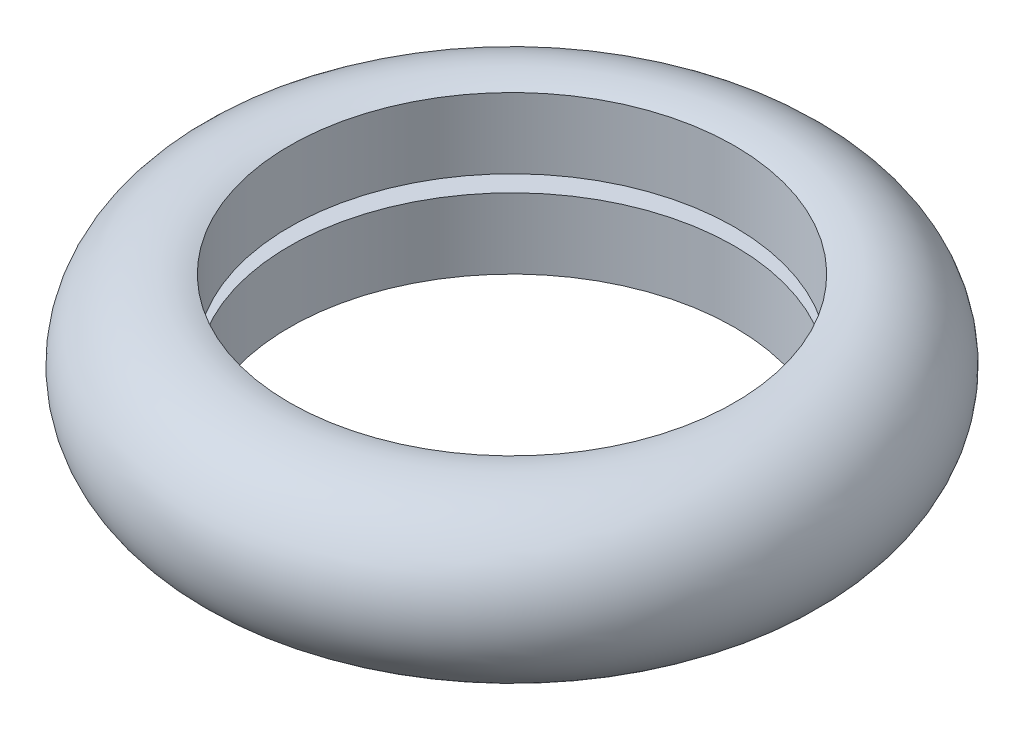
ISO-10303-21;
HEADER;
FILE_DESCRIPTION(('STEP AP214'),'2;1');
FILE_NAME('part.step','',(''),(''),'','','');
FILE_SCHEMA(('AUTOMOTIVE_DESIGN { 1 0 10303 214 1 1 1 1 }'));
ENDSEC;
DATA;
#1=APPLICATION_CONTEXT('core data for automotive mechanical design processes');
#2=APPLICATION_PROTOCOL_DEFINITION('international standard','automotive_design',2000,#1);
#3=PRODUCT_CONTEXT('',#1,'mechanical');
#4=PRODUCT('Part','Part','',(#3));
#5=PRODUCT_RELATED_PRODUCT_CATEGORY('part','',(#4));
#6=PRODUCT_DEFINITION_FORMATION('','',#4);
#7=PRODUCT_DEFINITION_CONTEXT('part definition',#1,'design');
#8=PRODUCT_DEFINITION('design','',#6,#7);
#9=PRODUCT_DEFINITION_SHAPE('','',#8);
#10=(LENGTH_UNIT() NAMED_UNIT(*) SI_UNIT(.MILLI.,.METRE.));
#11=(NAMED_UNIT(*) PLANE_ANGLE_UNIT() SI_UNIT($,.RADIAN.));
#12=(NAMED_UNIT(*) SI_UNIT($,.STERADIAN.) SOLID_ANGLE_UNIT());
#13=UNCERTAINTY_MEASURE_WITH_UNIT(LENGTH_MEASURE(1.E-05),#10,'distance_accuracy_value','');
#14=(GEOMETRIC_REPRESENTATION_CONTEXT(3) GLOBAL_UNCERTAINTY_ASSIGNED_CONTEXT((#13)) GLOBAL_UNIT_ASSIGNED_CONTEXT((#10,
#11,#12)) REPRESENTATION_CONTEXT('',''));
#15=CARTESIAN_POINT('',(0.,0.,0.));
#16=DIRECTION('',(0.,0.,1.));
#17=DIRECTION('',(1.,0.,0.));
#18=AXIS2_PLACEMENT_3D('',#15,#16,#17);
#19=CARTESIAN_POINT('',(0.,0.,0.));
#20=DIRECTION('',(0.,1.,0.));
#21=DIRECTION('',(0.,0.,1.));
#22=AXIS2_PLACEMENT_3D('',#19,#20,#21);
#23=CYLINDRICAL_SURFACE('',#22,40.5);
#24=CARTESIAN_POINT('',(0.,1.5,0.));
#25=DIRECTION('',(0.,1.,0.));
#26=DIRECTION('',(0.,0.,1.));
#27=AXIS2_PLACEMENT_3D('',#24,#25,#26);
#28=CIRCLE('',#27,40.5);
#29=CARTESIAN_POINT('',(0.,1.5,40.5));
#30=VERTEX_POINT('',#29);
#31=EDGE_CURVE('E66',#30,#30,#28,.T.);
#32=ORIENTED_EDGE('',*,*,#31,.F.);
#33=EDGE_LOOP('',(#32));
#34=FACE_BOUND('',#33,.T.);
#35=CARTESIAN_POINT('',(0.,14.3090880212542,0.));
#36=DIRECTION('',(0.,1.,0.));
#37=DIRECTION('',(0.,0.,1.));
#38=AXIS2_PLACEMENT_3D('',#35,#36,#37);
#39=CIRCLE('',#38,40.5);
#40=CARTESIAN_POINT('',(0.,14.3090880212542,40.5));
#41=VERTEX_POINT('',#40);
#42=EDGE_CURVE('E12',#41,#41,#39,.T.);
#43=ORIENTED_EDGE('',*,*,#42,.T.);
#44=EDGE_LOOP('',(#43));
#45=FACE_BOUND('',#44,.T.);
#46=ADVANCED_FACE('F44',(#34,#45),#23,.F.);
#47=CARTESIAN_POINT('',(0.,0.,0.));
#48=DIRECTION('',(0.,1.,0.));
#49=DIRECTION('',(0.,0.,1.));
#50=AXIS2_PLACEMENT_3D('',#47,#48,#49);
#51=TOROIDAL_SURFACE('',#50,45.,15.);
#52=CARTESIAN_POINT('',(0.,-14.3090880212542,0.));
#53=DIRECTION('',(0.,1.,0.));
#54=DIRECTION('',(0.,0.,1.));
#55=AXIS2_PLACEMENT_3D('',#52,#53,#54);
#56=CIRCLE('',#55,40.5);
#57=CARTESIAN_POINT('',(0.,-14.3090880212542,40.5));
#58=VERTEX_POINT('',#57);
#59=EDGE_CURVE('E50',#58,#58,#56,.T.);
#60=ORIENTED_EDGE('',*,*,#59,.T.);
#61=EDGE_LOOP('',(#60));
#62=FACE_BOUND('',#61,.T.);
#63=ORIENTED_EDGE('',*,*,#42,.F.);
#64=EDGE_LOOP('',(#63));
#65=FACE_BOUND('',#64,.T.);
#66=ADVANCED_FACE('F73',(#62,#65),#51,.T.);
#67=CARTESIAN_POINT('',(0.,0.,0.));
#68=DIRECTION('',(0.,1.,0.));
#69=DIRECTION('',(0.,0.,1.));
#70=AXIS2_PLACEMENT_3D('',#67,#68,#69);
#71=CYLINDRICAL_SURFACE('',#70,40.5);
#72=ORIENTED_EDGE('',*,*,#59,.F.);
#73=EDGE_LOOP('',(#72));
#74=FACE_BOUND('',#73,.T.);
#75=CARTESIAN_POINT('',(0.,-1.50000000000001,0.));
#76=DIRECTION('',(0.,1.,0.));
#77=DIRECTION('',(0.,0.,1.));
#78=AXIS2_PLACEMENT_3D('',#75,#76,#77);
#79=CIRCLE('',#78,40.5);
#80=CARTESIAN_POINT('',(0.,-1.50000000000001,40.5));
#81=VERTEX_POINT('',#80);
#82=EDGE_CURVE('E54',#81,#81,#79,.T.);
#83=ORIENTED_EDGE('',*,*,#82,.T.);
#84=EDGE_LOOP('',(#83));
#85=FACE_BOUND('',#84,.T.);
#86=ADVANCED_FACE('F77',(#74,#85),#71,.F.);
#87=CARTESIAN_POINT('',(0.,-1.50000000000001,0.));
#88=DIRECTION('',(0.,1.,0.));
#89=DIRECTION('',(0.,0.,1.));
#90=AXIS2_PLACEMENT_3D('',#87,#88,#89);
#91=PLANE('',#90);
#92=CARTESIAN_POINT('',(0.,-1.50000000000001,0.));
#93=DIRECTION('',(0.,1.,0.));
#94=DIRECTION('',(0.,0.,1.));
#95=AXIS2_PLACEMENT_3D('',#92,#93,#94);
#96=CIRCLE('',#95,46.5);
#97=CARTESIAN_POINT('',(0.,-1.50000000000001,46.5));
#98=VERTEX_POINT('',#97);
#99=EDGE_CURVE('E58',#98,#98,#96,.T.);
#100=ORIENTED_EDGE('',*,*,#99,.T.);
#101=EDGE_LOOP('',(#100));
#102=FACE_BOUND('',#101,.T.);
#103=ORIENTED_EDGE('',*,*,#82,.F.);
#104=EDGE_LOOP('',(#103));
#105=FACE_BOUND('',#104,.T.);
#106=ADVANCED_FACE('F81',(#102,#105),#91,.T.);
#107=CARTESIAN_POINT('',(0.,0.,0.));
#108=DIRECTION('',(0.,1.,0.));
#109=DIRECTION('',(0.,0.,1.));
#110=AXIS2_PLACEMENT_3D('',#107,#108,#109);
#111=CYLINDRICAL_SURFACE('',#110,46.5);
#112=ORIENTED_EDGE('',*,*,#99,.F.);
#113=EDGE_LOOP('',(#112));
#114=FACE_BOUND('',#113,.T.);
#115=CARTESIAN_POINT('',(0.,1.49999999999999,0.));
#116=DIRECTION('',(0.,1.,0.));
#117=DIRECTION('',(0.,0.,1.));
#118=AXIS2_PLACEMENT_3D('',#115,#116,#117);
#119=CIRCLE('',#118,46.5);
#120=CARTESIAN_POINT('',(0.,1.49999999999999,46.5));
#121=VERTEX_POINT('',#120);
#122=EDGE_CURVE('E63',#121,#121,#119,.T.);
#123=ORIENTED_EDGE('',*,*,#122,.T.);
#124=EDGE_LOOP('',(#123));
#125=FACE_BOUND('',#124,.T.);
#126=ADVANCED_FACE('F88',(#114,#125),#111,.F.);
#127=CARTESIAN_POINT('',(0.,1.5,0.));
#128=DIRECTION('',(0.,1.,0.));
#129=DIRECTION('',(0.,0.,1.));
#130=AXIS2_PLACEMENT_3D('',#127,#128,#129);
#131=PLANE('',#130);
#132=ORIENTED_EDGE('',*,*,#122,.F.);
#133=EDGE_LOOP('',(#132));
#134=FACE_BOUND('',#133,.T.);
#135=ORIENTED_EDGE('',*,*,#31,.T.);
#136=EDGE_LOOP('',(#135));
#137=FACE_BOUND('',#136,.T.);
#138=ADVANCED_FACE('F70',(#134,#137),#131,.F.);
#139=CLOSED_SHELL('',(#46,#66,#86,#106,#126,#138));
#140=MANIFOLD_SOLID_BREP('B2',#139);
#141=ADVANCED_BREP_SHAPE_REPRESENTATION('',(#18,#140),#14);
#142=SHAPE_DEFINITION_REPRESENTATION(#9,#141);
ENDSEC;
END-ISO-10303-21;
